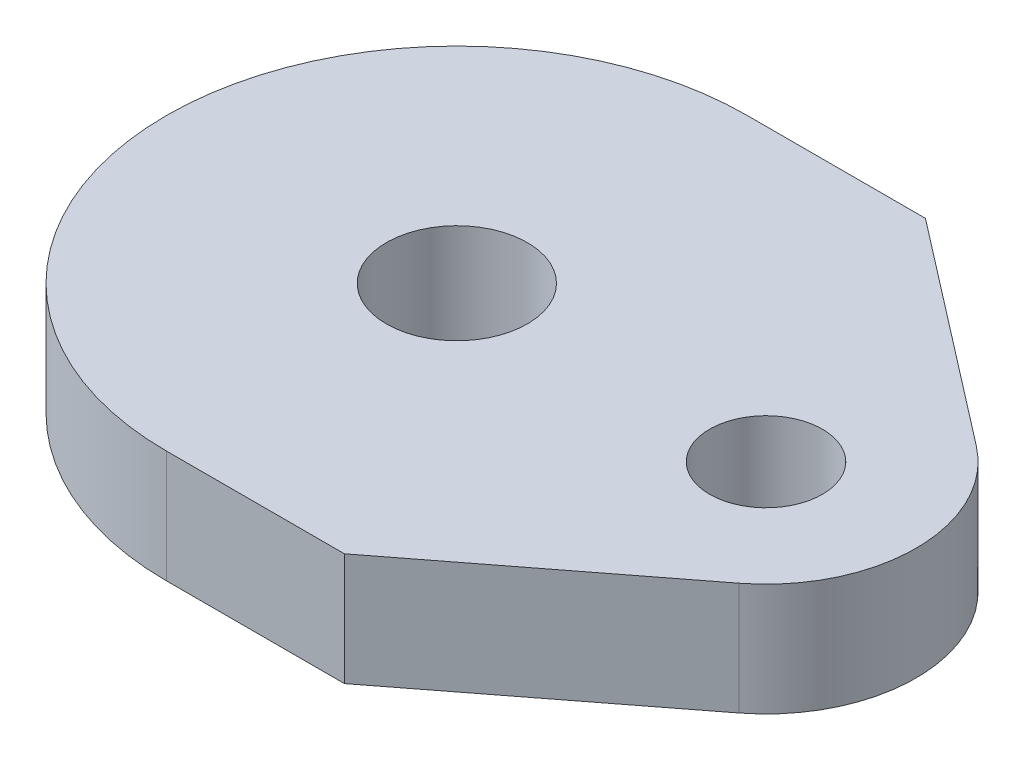
ISO-10303-21;
HEADER;
FILE_DESCRIPTION(('STEP AP214'),'2;1');
FILE_NAME('part.step','',(''),(''),'','','');
FILE_SCHEMA(('AUTOMOTIVE_DESIGN { 1 0 10303 214 1 1 1 1 }'));
ENDSEC;
DATA;
#1=APPLICATION_CONTEXT('core data for automotive mechanical design processes');
#2=APPLICATION_PROTOCOL_DEFINITION('international standard','automotive_design',2000,#1);
#3=PRODUCT_CONTEXT('',#1,'mechanical');
#4=PRODUCT('Part','Part','',(#3));
#5=PRODUCT_RELATED_PRODUCT_CATEGORY('part','',(#4));
#6=PRODUCT_DEFINITION_FORMATION('','',#4);
#7=PRODUCT_DEFINITION_CONTEXT('part definition',#1,'design');
#8=PRODUCT_DEFINITION('design','',#6,#7);
#9=PRODUCT_DEFINITION_SHAPE('','',#8);
#10=(LENGTH_UNIT() NAMED_UNIT(*) SI_UNIT(.MILLI.,.METRE.));
#11=(NAMED_UNIT(*) PLANE_ANGLE_UNIT() SI_UNIT($,.RADIAN.));
#12=(NAMED_UNIT(*) SI_UNIT($,.STERADIAN.) SOLID_ANGLE_UNIT());
#13=UNCERTAINTY_MEASURE_WITH_UNIT(LENGTH_MEASURE(1.E-05),#10,'distance_accuracy_value','');
#14=(GEOMETRIC_REPRESENTATION_CONTEXT(3) GLOBAL_UNCERTAINTY_ASSIGNED_CONTEXT((#13)) GLOBAL_UNIT_ASSIGNED_CONTEXT((#10,
#11,#12)) REPRESENTATION_CONTEXT('',''));
#15=CARTESIAN_POINT('',(0.,0.,0.));
#16=DIRECTION('',(0.,0.,1.));
#17=DIRECTION('',(1.,0.,0.));
#18=AXIS2_PLACEMENT_3D('',#15,#16,#17);
#19=CARTESIAN_POINT('',(0.,6.35,-16.4084));
#20=DIRECTION('',(0.,1.,0.));
#21=DIRECTION('',(0.,0.,1.));
#22=AXIS2_PLACEMENT_3D('',#19,#20,#21);
#23=PLANE('',#22);
#24=CARTESIAN_POINT('',(0.,6.35,-16.4084));
#25=DIRECTION('',(0.,1.,0.));
#26=DIRECTION('',(0.,0.,1.));
#27=AXIS2_PLACEMENT_3D('',#24,#25,#26);
#28=CIRCLE('',#27,3.98145);
#29=CARTESIAN_POINT('',(0.,6.35,-12.42695));
#30=VERTEX_POINT('',#29);
#31=EDGE_CURVE('E140',#30,#30,#28,.T.);
#32=ORIENTED_EDGE('',*,*,#31,.F.);
#33=EDGE_LOOP('',(#32));
#34=FACE_BOUND('',#33,.T.);
#35=CARTESIAN_POINT('',(0.,6.35,-16.4084));
#36=DIRECTION('',(0.,1.,0.));
#37=DIRECTION('',(0.,0.,1.));
#38=AXIS2_PLACEMENT_3D('',#35,#36,#37);
#39=CIRCLE('',#38,16.4084);
#40=CARTESIAN_POINT('',(0.,6.35,-32.8168));
#41=VERTEX_POINT('',#40);
#42=CARTESIAN_POINT('',(0.,6.35,0.));
#43=VERTEX_POINT('',#42);
#44=EDGE_CURVE('E152',#41,#43,#39,.T.);
#45=ORIENTED_EDGE('',*,*,#44,.T.);
#46=DIRECTION('',(1.,0.,0.));
#47=VECTOR('',#46,1.);
#48=CARTESIAN_POINT('',(0.,6.35,0.));
#49=LINE('',#48,#47);
#50=CARTESIAN_POINT('',(10.0584,6.35,0.));
#51=VERTEX_POINT('',#50);
#52=EDGE_CURVE('E100',#43,#51,#49,.T.);
#53=ORIENTED_EDGE('',*,*,#52,.T.);
#54=DIRECTION('',(0.791838774230678,0.,-0.610730182343117));
#55=VECTOR('',#54,1.);
#56=CARTESIAN_POINT('',(10.0584,6.35,0.));
#57=LINE('',#56,#55);
#58=CARTESIAN_POINT('',(22.6359343016103,6.35,-9.70081292736935));
#59=VERTEX_POINT('',#58);
#60=EDGE_CURVE('E113',#51,#59,#57,.T.);
#61=ORIENTED_EDGE('',*,*,#60,.T.);
#62=CARTESIAN_POINT('',(17.4625,6.35,-16.4084));
#63=DIRECTION('',(0.,1.,0.));
#64=DIRECTION('',(0.,0.,1.));
#65=AXIS2_PLACEMENT_3D('',#62,#63,#64);
#66=CIRCLE('',#65,8.4709);
#67=CARTESIAN_POINT('',(22.6359343016103,6.35,-23.1159870726307));
#68=VERTEX_POINT('',#67);
#69=EDGE_CURVE('E107',#59,#68,#66,.T.);
#70=ORIENTED_EDGE('',*,*,#69,.T.);
#71=DIRECTION('',(-0.791838774230678,0.,-0.610730182343117));
#72=VECTOR('',#71,1.);
#73=CARTESIAN_POINT('',(22.6359343016103,6.35,-23.1159870726307));
#74=LINE('',#73,#72);
#75=CARTESIAN_POINT('',(10.0584,6.35,-32.8168));
#76=VERTEX_POINT('',#75);
#77=EDGE_CURVE('E111',#68,#76,#74,.T.);
#78=ORIENTED_EDGE('',*,*,#77,.T.);
#79=DIRECTION('',(-1.,0.,0.));
#80=VECTOR('',#79,1.);
#81=CARTESIAN_POINT('',(10.0584,6.35,-32.8168));
#82=LINE('',#81,#80);
#83=EDGE_CURVE('E63',#76,#41,#82,.T.);
#84=ORIENTED_EDGE('',*,*,#83,.T.);
#85=EDGE_LOOP('',(#45,#53,#61,#70,#78,#84));
#86=FACE_BOUND('',#85,.T.);
#87=CARTESIAN_POINT('',(17.4625,6.35,-16.4084));
#88=DIRECTION('',(0.,1.,0.));
#89=DIRECTION('',(0.,0.,1.));
#90=AXIS2_PLACEMENT_3D('',#87,#88,#89);
#91=CIRCLE('',#90,3.1877);
#92=CARTESIAN_POINT('',(17.4625,6.35,-13.2207));
#93=VERTEX_POINT('',#92);
#94=EDGE_CURVE('E198',#93,#93,#91,.T.);
#95=ORIENTED_EDGE('',*,*,#94,.F.);
#96=EDGE_LOOP('',(#95));
#97=FACE_BOUND('',#96,.T.);
#98=ADVANCED_FACE('F45',(#34,#86,#97),#23,.T.);
#99=CARTESIAN_POINT('',(0.,0.,-16.4084));
#100=DIRECTION('',(0.,1.,0.));
#101=DIRECTION('',(0.,0.,1.));
#102=AXIS2_PLACEMENT_3D('',#99,#100,#101);
#103=PLANE('',#102);
#104=CARTESIAN_POINT('',(0.,0.,-16.4084));
#105=DIRECTION('',(0.,1.,0.));
#106=DIRECTION('',(0.,0.,1.));
#107=AXIS2_PLACEMENT_3D('',#104,#105,#106);
#108=CIRCLE('',#107,16.4084);
#109=CARTESIAN_POINT('',(0.,0.,-32.8168));
#110=VERTEX_POINT('',#109);
#111=CARTESIAN_POINT('',(0.,0.,0.));
#112=VERTEX_POINT('',#111);
#113=EDGE_CURVE('E135',#110,#112,#108,.T.);
#114=ORIENTED_EDGE('',*,*,#113,.F.);
#115=DIRECTION('',(-1.,0.,0.));
#116=VECTOR('',#115,1.);
#117=CARTESIAN_POINT('',(10.0584,0.,-32.8168));
#118=LINE('',#117,#116);
#119=CARTESIAN_POINT('',(10.0584,0.,-32.8168));
#120=VERTEX_POINT('',#119);
#121=EDGE_CURVE('E92',#120,#110,#118,.T.);
#122=ORIENTED_EDGE('',*,*,#121,.F.);
#123=DIRECTION('',(-0.791838774230678,0.,-0.610730182343117));
#124=VECTOR('',#123,1.);
#125=CARTESIAN_POINT('',(22.6359343016103,0.,-23.1159870726307));
#126=LINE('',#125,#124);
#127=CARTESIAN_POINT('',(22.6359343016103,0.,-23.1159870726307));
#128=VERTEX_POINT('',#127);
#129=EDGE_CURVE('E86',#128,#120,#126,.T.);
#130=ORIENTED_EDGE('',*,*,#129,.F.);
#131=CARTESIAN_POINT('',(17.4625,0.,-16.4084));
#132=DIRECTION('',(0.,1.,0.));
#133=DIRECTION('',(0.,0.,1.));
#134=AXIS2_PLACEMENT_3D('',#131,#132,#133);
#135=CIRCLE('',#134,8.4709);
#136=CARTESIAN_POINT('',(22.6359343016103,0.,-9.70081292736935));
#137=VERTEX_POINT('',#136);
#138=EDGE_CURVE('E122',#137,#128,#135,.T.);
#139=ORIENTED_EDGE('',*,*,#138,.F.);
#140=DIRECTION('',(0.791838774230678,0.,-0.610730182343117));
#141=VECTOR('',#140,1.);
#142=CARTESIAN_POINT('',(10.0584,0.,0.));
#143=LINE('',#142,#141);
#144=CARTESIAN_POINT('',(10.0584,0.,0.));
#145=VERTEX_POINT('',#144);
#146=EDGE_CURVE('E143',#145,#137,#143,.T.);
#147=ORIENTED_EDGE('',*,*,#146,.F.);
#148=DIRECTION('',(1.,0.,0.));
#149=VECTOR('',#148,1.);
#150=CARTESIAN_POINT('',(0.,0.,0.));
#151=LINE('',#150,#149);
#152=EDGE_CURVE('E139',#112,#145,#151,.T.);
#153=ORIENTED_EDGE('',*,*,#152,.F.);
#154=EDGE_LOOP('',(#114,#122,#130,#139,#147,#153));
#155=FACE_BOUND('',#154,.T.);
#156=CARTESIAN_POINT('',(0.,0.,-16.4084));
#157=DIRECTION('',(0.,1.,0.));
#158=DIRECTION('',(0.,0.,1.));
#159=AXIS2_PLACEMENT_3D('',#156,#157,#158);
#160=CIRCLE('',#159,3.98145);
#161=CARTESIAN_POINT('',(0.,0.,-12.42695));
#162=VERTEX_POINT('',#161);
#163=EDGE_CURVE('E206',#162,#162,#160,.T.);
#164=ORIENTED_EDGE('',*,*,#163,.T.);
#165=EDGE_LOOP('',(#164));
#166=FACE_BOUND('',#165,.T.);
#167=CARTESIAN_POINT('',(17.4625,0.,-16.4084));
#168=DIRECTION('',(0.,1.,0.));
#169=DIRECTION('',(0.,0.,1.));
#170=AXIS2_PLACEMENT_3D('',#167,#168,#169);
#171=CIRCLE('',#170,3.1877);
#172=CARTESIAN_POINT('',(17.4625,0.,-13.2207));
#173=VERTEX_POINT('',#172);
#174=EDGE_CURVE('E201',#173,#173,#171,.T.);
#175=ORIENTED_EDGE('',*,*,#174,.T.);
#176=EDGE_LOOP('',(#175));
#177=FACE_BOUND('',#176,.T.);
#178=ADVANCED_FACE('F165',(#155,#166,#177),#103,.F.);
#179=CARTESIAN_POINT('',(0.,6.35,-16.4084));
#180=DIRECTION('',(0.,-1.,0.));
#181=DIRECTION('',(0.,0.,-1.));
#182=AXIS2_PLACEMENT_3D('',#179,#180,#181);
#183=CYLINDRICAL_SURFACE('',#182,16.4084);
#184=ORIENTED_EDGE('',*,*,#113,.T.);
#185=DIRECTION('',(0.,-1.,0.));
#186=VECTOR('',#185,1.);
#187=CARTESIAN_POINT('',(0.,6.35,0.));
#188=LINE('',#187,#186);
#189=EDGE_CURVE('E11',#43,#112,#188,.T.);
#190=ORIENTED_EDGE('',*,*,#189,.F.);
#191=ORIENTED_EDGE('',*,*,#44,.F.);
#192=DIRECTION('',(0.,-1.,0.));
#193=VECTOR('',#192,1.);
#194=CARTESIAN_POINT('',(0.,6.35,-32.8168));
#195=LINE('',#194,#193);
#196=EDGE_CURVE('E131',#41,#110,#195,.T.);
#197=ORIENTED_EDGE('',*,*,#196,.T.);
#198=EDGE_LOOP('',(#184,#190,#191,#197));
#199=FACE_BOUND('',#198,.T.);
#200=ADVANCED_FACE('F47',(#199),#183,.T.);
#201=CARTESIAN_POINT('',(0.,6.35,0.));
#202=DIRECTION('',(0.,0.,-1.));
#203=DIRECTION('',(-1.,0.,0.));
#204=AXIS2_PLACEMENT_3D('',#201,#202,#203);
#205=PLANE('',#204);
#206=ORIENTED_EDGE('',*,*,#152,.T.);
#207=DIRECTION('',(0.,-1.,0.));
#208=VECTOR('',#207,1.);
#209=CARTESIAN_POINT('',(10.0584,6.35,0.));
#210=LINE('',#209,#208);
#211=EDGE_CURVE('E55',#51,#145,#210,.T.);
#212=ORIENTED_EDGE('',*,*,#211,.F.);
#213=ORIENTED_EDGE('',*,*,#52,.F.);
#214=ORIENTED_EDGE('',*,*,#189,.T.);
#215=EDGE_LOOP('',(#206,#212,#213,#214));
#216=FACE_BOUND('',#215,.T.);
#217=ADVANCED_FACE('F254',(#216),#205,.F.);
#218=CARTESIAN_POINT('',(10.0584,6.35,0.));
#219=DIRECTION('',(-0.610730182343117,0.,-0.791838774230678));
#220=DIRECTION('',(-0.791838774230678,0.,0.610730182343117));
#221=AXIS2_PLACEMENT_3D('',#218,#219,#220);
#222=PLANE('',#221);
#223=ORIENTED_EDGE('',*,*,#146,.T.);
#224=DIRECTION('',(0.,-1.,0.));
#225=VECTOR('',#224,1.);
#226=CARTESIAN_POINT('',(22.6359343016103,6.35,-9.70081292736935));
#227=LINE('',#226,#225);
#228=EDGE_CURVE('E124',#59,#137,#227,.T.);
#229=ORIENTED_EDGE('',*,*,#228,.F.);
#230=ORIENTED_EDGE('',*,*,#60,.F.);
#231=ORIENTED_EDGE('',*,*,#211,.T.);
#232=EDGE_LOOP('',(#223,#229,#230,#231));
#233=FACE_BOUND('',#232,.T.);
#234=ADVANCED_FACE('F162',(#233),#222,.F.);
#235=CARTESIAN_POINT('',(17.4625,6.35,-16.4084));
#236=DIRECTION('',(0.,-1.,0.));
#237=DIRECTION('',(0.,0.,-1.));
#238=AXIS2_PLACEMENT_3D('',#235,#236,#237);
#239=CYLINDRICAL_SURFACE('',#238,8.4709);
#240=ORIENTED_EDGE('',*,*,#138,.T.);
#241=DIRECTION('',(0.,-1.,0.));
#242=VECTOR('',#241,1.);
#243=CARTESIAN_POINT('',(22.6359343016103,6.35,-23.1159870726307));
#244=LINE('',#243,#242);
#245=EDGE_CURVE('E119',#68,#128,#244,.T.);
#246=ORIENTED_EDGE('',*,*,#245,.F.);
#247=ORIENTED_EDGE('',*,*,#69,.F.);
#248=ORIENTED_EDGE('',*,*,#228,.T.);
#249=EDGE_LOOP('',(#240,#246,#247,#248));
#250=FACE_BOUND('',#249,.T.);
#251=ADVANCED_FACE('F120',(#250),#239,.T.);
#252=CARTESIAN_POINT('',(22.6359343016103,6.35,-23.1159870726307));
#253=DIRECTION('',(-0.610730182343117,0.,0.791838774230678));
#254=DIRECTION('',(0.791838774230678,0.,0.610730182343117));
#255=AXIS2_PLACEMENT_3D('',#252,#253,#254);
#256=PLANE('',#255);
#257=ORIENTED_EDGE('',*,*,#129,.T.);
#258=DIRECTION('',(0.,-1.,0.));
#259=VECTOR('',#258,1.);
#260=CARTESIAN_POINT('',(10.0584,6.35,-32.8168));
#261=LINE('',#260,#259);
#262=EDGE_CURVE('E125',#76,#120,#261,.T.);
#263=ORIENTED_EDGE('',*,*,#262,.F.);
#264=ORIENTED_EDGE('',*,*,#77,.F.);
#265=ORIENTED_EDGE('',*,*,#245,.T.);
#266=EDGE_LOOP('',(#257,#263,#264,#265));
#267=FACE_BOUND('',#266,.T.);
#268=ADVANCED_FACE('F127',(#267),#256,.F.);
#269=CARTESIAN_POINT('',(10.0584,6.35,-32.8168));
#270=DIRECTION('',(0.,0.,1.));
#271=DIRECTION('',(1.,0.,0.));
#272=AXIS2_PLACEMENT_3D('',#269,#270,#271);
#273=PLANE('',#272);
#274=ORIENTED_EDGE('',*,*,#121,.T.);
#275=ORIENTED_EDGE('',*,*,#196,.F.);
#276=ORIENTED_EDGE('',*,*,#83,.F.);
#277=ORIENTED_EDGE('',*,*,#262,.T.);
#278=EDGE_LOOP('',(#274,#275,#276,#277));
#279=FACE_BOUND('',#278,.T.);
#280=ADVANCED_FACE('F170',(#279),#273,.F.);
#281=CARTESIAN_POINT('',(0.,6.35,-16.4084));
#282=DIRECTION('',(0.,-1.,0.));
#283=DIRECTION('',(0.,0.,-1.));
#284=AXIS2_PLACEMENT_3D('',#281,#282,#283);
#285=CYLINDRICAL_SURFACE('',#284,3.98145);
#286=ORIENTED_EDGE('',*,*,#31,.T.);
#287=EDGE_LOOP('',(#286));
#288=FACE_BOUND('',#287,.T.);
#289=ORIENTED_EDGE('',*,*,#163,.F.);
#290=EDGE_LOOP('',(#289));
#291=FACE_BOUND('',#290,.T.);
#292=ADVANCED_FACE('F172',(#288,#291),#285,.F.);
#293=CARTESIAN_POINT('',(17.4625,6.35,-16.4084));
#294=DIRECTION('',(0.,-1.,0.));
#295=DIRECTION('',(0.,0.,-1.));
#296=AXIS2_PLACEMENT_3D('',#293,#294,#295);
#297=CYLINDRICAL_SURFACE('',#296,3.1877);
#298=ORIENTED_EDGE('',*,*,#94,.T.);
#299=EDGE_LOOP('',(#298));
#300=FACE_BOUND('',#299,.T.);
#301=ORIENTED_EDGE('',*,*,#174,.F.);
#302=EDGE_LOOP('',(#301));
#303=FACE_BOUND('',#302,.T.);
#304=ADVANCED_FACE('F178',(#300,#303),#297,.F.);
#305=CLOSED_SHELL('',(#98,#178,#200,#217,#234,#251,#268,#280,#292,#304));
#306=MANIFOLD_SOLID_BREP('B2',#305);
#307=ADVANCED_BREP_SHAPE_REPRESENTATION('',(#18,#306),#14);
#308=SHAPE_DEFINITION_REPRESENTATION(#9,#307);
ENDSEC;
END-ISO-10303-21;
